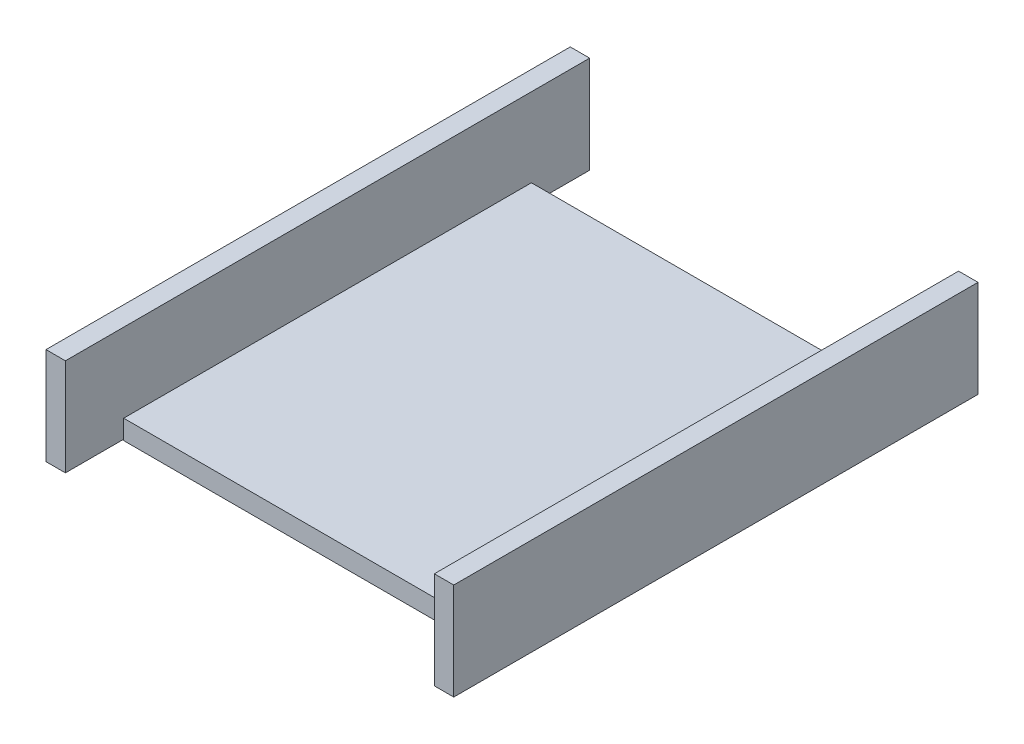
ISO-10303-21;
HEADER;
FILE_DESCRIPTION(('STEP AP214'),'2;1');
FILE_NAME('part.step','',(''),(''),'','','');
FILE_SCHEMA(('AUTOMOTIVE_DESIGN { 1 0 10303 214 1 1 1 1 }'));
ENDSEC;
DATA;
#1=APPLICATION_CONTEXT('core data for automotive mechanical design processes');
#2=APPLICATION_PROTOCOL_DEFINITION('international standard','automotive_design',2000,#1);
#3=PRODUCT_CONTEXT('',#1,'mechanical');
#4=PRODUCT('Part','Part','',(#3));
#5=PRODUCT_RELATED_PRODUCT_CATEGORY('part','',(#4));
#6=PRODUCT_DEFINITION_FORMATION('','',#4);
#7=PRODUCT_DEFINITION_CONTEXT('part definition',#1,'design');
#8=PRODUCT_DEFINITION('design','',#6,#7);
#9=PRODUCT_DEFINITION_SHAPE('','',#8);
#10=(LENGTH_UNIT() NAMED_UNIT(*) SI_UNIT(.MILLI.,.METRE.));
#11=(NAMED_UNIT(*) PLANE_ANGLE_UNIT() SI_UNIT($,.RADIAN.));
#12=(NAMED_UNIT(*) SI_UNIT($,.STERADIAN.) SOLID_ANGLE_UNIT());
#13=UNCERTAINTY_MEASURE_WITH_UNIT(LENGTH_MEASURE(1.E-05),#10,'distance_accuracy_value','');
#14=(GEOMETRIC_REPRESENTATION_CONTEXT(3) GLOBAL_UNCERTAINTY_ASSIGNED_CONTEXT((#13)) GLOBAL_UNIT_ASSIGNED_CONTEXT((#10,
#11,#12)) REPRESENTATION_CONTEXT('',''));
#15=CARTESIAN_POINT('',(0.,0.,0.));
#16=DIRECTION('',(0.,0.,1.));
#17=DIRECTION('',(1.,0.,0.));
#18=AXIS2_PLACEMENT_3D('',#15,#16,#17);
#19=CARTESIAN_POINT('',(5.,12.5,-67.5));
#20=DIRECTION('',(0.,0.,1.));
#21=DIRECTION('',(1.,0.,0.));
#22=AXIS2_PLACEMENT_3D('',#19,#20,#21);
#23=PLANE('',#22);
#24=DIRECTION('',(0.,1.,0.));
#25=VECTOR('',#24,1.);
#26=CARTESIAN_POINT('',(0.,12.5,-67.5));
#27=LINE('',#26,#25);
#28=CARTESIAN_POINT('',(0.,-12.5,-67.5));
#29=VERTEX_POINT('',#28);
#30=CARTESIAN_POINT('',(0.,12.5,-67.5));
#31=VERTEX_POINT('',#30);
#32=EDGE_CURVE('E202',#29,#31,#27,.T.);
#33=ORIENTED_EDGE('',*,*,#32,.T.);
#34=DIRECTION('',(-1.,0.,0.));
#35=VECTOR('',#34,1.);
#36=CARTESIAN_POINT('',(5.,12.5,-67.5));
#37=LINE('',#36,#35);
#38=CARTESIAN_POINT('',(5.,12.5,-67.5));
#39=VERTEX_POINT('',#38);
#40=EDGE_CURVE('E38',#39,#31,#37,.T.);
#41=ORIENTED_EDGE('',*,*,#40,.F.);
#42=DIRECTION('',(0.,1.,0.));
#43=VECTOR('',#42,1.);
#44=CARTESIAN_POINT('',(5.,12.5,-67.5));
#45=LINE('',#44,#43);
#46=CARTESIAN_POINT('',(5.,-12.5,-67.5));
#47=VERTEX_POINT('',#46);
#48=EDGE_CURVE('E203',#47,#39,#45,.T.);
#49=ORIENTED_EDGE('',*,*,#48,.F.);
#50=DIRECTION('',(-1.,0.,0.));
#51=VECTOR('',#50,1.);
#52=CARTESIAN_POINT('',(5.,-12.5,-67.5));
#53=LINE('',#52,#51);
#54=EDGE_CURVE('E214',#47,#29,#53,.T.);
#55=ORIENTED_EDGE('',*,*,#54,.T.);
#56=EDGE_LOOP('',(#33,#41,#49,#55));
#57=FACE_BOUND('',#56,.T.);
#58=ADVANCED_FACE('F35',(#57),#23,.F.);
#59=CARTESIAN_POINT('',(5.,12.5,67.5));
#60=DIRECTION('',(0.,-1.,0.));
#61=DIRECTION('',(0.,0.,-1.));
#62=AXIS2_PLACEMENT_3D('',#59,#60,#61);
#63=PLANE('',#62);
#64=DIRECTION('',(0.,0.,1.));
#65=VECTOR('',#64,1.);
#66=CARTESIAN_POINT('',(0.,12.5,67.5));
#67=LINE('',#66,#65);
#68=CARTESIAN_POINT('',(0.,12.5,67.5));
#69=VERTEX_POINT('',#68);
#70=EDGE_CURVE('E218',#31,#69,#67,.T.);
#71=ORIENTED_EDGE('',*,*,#70,.T.);
#72=DIRECTION('',(-1.,0.,0.));
#73=VECTOR('',#72,1.);
#74=CARTESIAN_POINT('',(5.,12.5,67.5));
#75=LINE('',#74,#73);
#76=CARTESIAN_POINT('',(5.,12.5,67.5));
#77=VERTEX_POINT('',#76);
#78=EDGE_CURVE('E227',#77,#69,#75,.T.);
#79=ORIENTED_EDGE('',*,*,#78,.F.);
#80=DIRECTION('',(0.,0.,1.));
#81=VECTOR('',#80,1.);
#82=CARTESIAN_POINT('',(5.,12.5,67.5));
#83=LINE('',#82,#81);
#84=EDGE_CURVE('E206',#39,#77,#83,.T.);
#85=ORIENTED_EDGE('',*,*,#84,.F.);
#86=ORIENTED_EDGE('',*,*,#40,.T.);
#87=EDGE_LOOP('',(#71,#79,#85,#86));
#88=FACE_BOUND('',#87,.T.);
#89=ADVANCED_FACE('F274',(#88),#63,.F.);
#90=CARTESIAN_POINT('',(5.,12.5,67.5));
#91=DIRECTION('',(0.,0.,-1.));
#92=DIRECTION('',(-1.,0.,0.));
#93=AXIS2_PLACEMENT_3D('',#90,#91,#92);
#94=PLANE('',#93);
#95=DIRECTION('',(0.,-1.,0.));
#96=VECTOR('',#95,1.);
#97=CARTESIAN_POINT('',(0.,12.5,67.5));
#98=LINE('',#97,#96);
#99=CARTESIAN_POINT('',(0.,-12.5,67.5));
#100=VERTEX_POINT('',#99);
#101=EDGE_CURVE('E220',#69,#100,#98,.T.);
#102=ORIENTED_EDGE('',*,*,#101,.T.);
#103=DIRECTION('',(-1.,0.,0.));
#104=VECTOR('',#103,1.);
#105=CARTESIAN_POINT('',(5.,-12.5,67.5));
#106=LINE('',#105,#104);
#107=CARTESIAN_POINT('',(5.,-12.5,67.5));
#108=VERTEX_POINT('',#107);
#109=EDGE_CURVE('E225',#108,#100,#106,.T.);
#110=ORIENTED_EDGE('',*,*,#109,.F.);
#111=DIRECTION('',(0.,-1.,0.));
#112=VECTOR('',#111,1.);
#113=CARTESIAN_POINT('',(5.,12.5,67.5));
#114=LINE('',#113,#112);
#115=EDGE_CURVE('E209',#77,#108,#114,.T.);
#116=ORIENTED_EDGE('',*,*,#115,.F.);
#117=ORIENTED_EDGE('',*,*,#78,.T.);
#118=EDGE_LOOP('',(#102,#110,#116,#117));
#119=FACE_BOUND('',#118,.T.);
#120=ADVANCED_FACE('F276',(#119),#94,.F.);
#121=CARTESIAN_POINT('',(5.,-12.5,67.5));
#122=DIRECTION('',(0.,1.,0.));
#123=DIRECTION('',(0.,0.,1.));
#124=AXIS2_PLACEMENT_3D('',#121,#122,#123);
#125=PLANE('',#124);
#126=DIRECTION('',(0.,0.,-1.));
#127=VECTOR('',#126,1.);
#128=CARTESIAN_POINT('',(0.,-12.5,67.5));
#129=LINE('',#128,#127);
#130=EDGE_CURVE('E207',#100,#29,#129,.T.);
#131=ORIENTED_EDGE('',*,*,#130,.T.);
#132=ORIENTED_EDGE('',*,*,#54,.F.);
#133=DIRECTION('',(0.,0.,-1.));
#134=VECTOR('',#133,1.);
#135=CARTESIAN_POINT('',(5.,-12.5,67.5));
#136=LINE('',#135,#134);
#137=CARTESIAN_POINT('',(5.,-12.5,-52.5));
#138=VERTEX_POINT('',#137);
#139=EDGE_CURVE('E211',#138,#47,#136,.T.);
#140=ORIENTED_EDGE('',*,*,#139,.F.);
#141=CARTESIAN_POINT('',(5.,-12.5,52.5));
#142=VERTEX_POINT('',#141);
#143=EDGE_CURVE('E215',#142,#138,#136,.T.);
#144=ORIENTED_EDGE('',*,*,#143,.F.);
#145=EDGE_CURVE('E212',#108,#142,#136,.T.);
#146=ORIENTED_EDGE('',*,*,#145,.F.);
#147=ORIENTED_EDGE('',*,*,#109,.T.);
#148=EDGE_LOOP('',(#131,#132,#140,#144,#146,#147));
#149=FACE_BOUND('',#148,.T.);
#150=ADVANCED_FACE('F268',(#149),#125,.F.);
#151=CARTESIAN_POINT('',(5.,0.,0.));
#152=DIRECTION('',(1.,0.,0.));
#153=DIRECTION('',(0.,0.,-1.));
#154=AXIS2_PLACEMENT_3D('',#151,#152,#153);
#155=PLANE('',#154);
#156=DIRECTION('',(0.,-1.,0.));
#157=VECTOR('',#156,1.);
#158=CARTESIAN_POINT('',(5.,-12.8008709671914,52.5));
#159=LINE('',#158,#157);
#160=CARTESIAN_POINT('',(5.,-7.80087096719144,52.5));
#161=VERTEX_POINT('',#160);
#162=EDGE_CURVE('E59',#161,#142,#159,.T.);
#163=ORIENTED_EDGE('',*,*,#162,.F.);
#164=DIRECTION('',(0.,0.,1.));
#165=VECTOR('',#164,1.);
#166=CARTESIAN_POINT('',(5.,-7.80087096719143,-52.5));
#167=LINE('',#166,#165);
#168=CARTESIAN_POINT('',(5.,-7.80087096719143,-52.5));
#169=VERTEX_POINT('',#168);
#170=EDGE_CURVE('E189',#169,#161,#167,.T.);
#171=ORIENTED_EDGE('',*,*,#170,.F.);
#172=DIRECTION('',(0.,1.,0.));
#173=VECTOR('',#172,1.);
#174=CARTESIAN_POINT('',(5.,-12.8008709671914,-52.5));
#175=LINE('',#174,#173);
#176=EDGE_CURVE('E43',#138,#169,#175,.T.);
#177=ORIENTED_EDGE('',*,*,#176,.F.);
#178=ORIENTED_EDGE('',*,*,#139,.T.);
#179=ORIENTED_EDGE('',*,*,#48,.T.);
#180=ORIENTED_EDGE('',*,*,#84,.T.);
#181=ORIENTED_EDGE('',*,*,#115,.T.);
#182=ORIENTED_EDGE('',*,*,#145,.T.);
#183=EDGE_LOOP('',(#163,#171,#177,#178,#179,#180,#181,#182));
#184=FACE_BOUND('',#183,.T.);
#185=ADVANCED_FACE('F266',(#184),#155,.T.);
#186=CARTESIAN_POINT('',(0.,0.,0.));
#187=DIRECTION('',(1.,0.,0.));
#188=DIRECTION('',(0.,0.,-1.));
#189=AXIS2_PLACEMENT_3D('',#186,#187,#188);
#190=PLANE('',#189);
#191=ORIENTED_EDGE('',*,*,#32,.F.);
#192=ORIENTED_EDGE('',*,*,#130,.F.);
#193=ORIENTED_EDGE('',*,*,#101,.F.);
#194=ORIENTED_EDGE('',*,*,#70,.F.);
#195=EDGE_LOOP('',(#191,#192,#193,#194));
#196=FACE_BOUND('',#195,.T.);
#197=ADVANCED_FACE('F273',(#196),#190,.F.);
#198=CARTESIAN_POINT('',(5.,0.,0.));
#199=DIRECTION('',(1.,0.,0.));
#200=DIRECTION('',(0.,0.,-1.));
#201=AXIS2_PLACEMENT_3D('',#198,#199,#200);
#202=PLANE('',#201);
#203=CARTESIAN_POINT('',(5.,-12.8008709671914,52.5));
#204=VERTEX_POINT('',#203);
#205=EDGE_CURVE('E164',#142,#204,#159,.T.);
#206=ORIENTED_EDGE('',*,*,#205,.F.);
#207=ORIENTED_EDGE('',*,*,#143,.T.);
#208=CARTESIAN_POINT('',(5.,-12.8008709671914,-52.5));
#209=VERTEX_POINT('',#208);
#210=EDGE_CURVE('E186',#209,#138,#175,.T.);
#211=ORIENTED_EDGE('',*,*,#210,.F.);
#212=DIRECTION('',(0.,0.,-1.));
#213=VECTOR('',#212,1.);
#214=CARTESIAN_POINT('',(5.,-12.8008709671914,-52.5));
#215=LINE('',#214,#213);
#216=EDGE_CURVE('E184',#204,#209,#215,.T.);
#217=ORIENTED_EDGE('',*,*,#216,.F.);
#218=EDGE_LOOP('',(#206,#207,#211,#217));
#219=FACE_BOUND('',#218,.T.);
#220=ADVANCED_FACE('F261',(#219),#202,.F.);
#221=CARTESIAN_POINT('',(100.,-12.8008709671914,52.5));
#222=DIRECTION('',(0.,0.,-1.));
#223=DIRECTION('',(-1.,0.,0.));
#224=AXIS2_PLACEMENT_3D('',#221,#222,#223);
#225=PLANE('',#224);
#226=ORIENTED_EDGE('',*,*,#162,.T.);
#227=ORIENTED_EDGE('',*,*,#205,.T.);
#228=DIRECTION('',(-1.,0.,0.));
#229=VECTOR('',#228,1.);
#230=CARTESIAN_POINT('',(100.,-12.8008709671914,52.5));
#231=LINE('',#230,#229);
#232=CARTESIAN_POINT('',(100.,-12.8008709671914,52.5));
#233=VERTEX_POINT('',#232);
#234=EDGE_CURVE('E199',#233,#204,#231,.T.);
#235=ORIENTED_EDGE('',*,*,#234,.F.);
#236=DIRECTION('',(0.,-1.,0.));
#237=VECTOR('',#236,1.);
#238=CARTESIAN_POINT('',(100.,-12.8008709671914,52.5));
#239=LINE('',#238,#237);
#240=CARTESIAN_POINT('',(100.,-12.5,52.5));
#241=VERTEX_POINT('',#240);
#242=EDGE_CURVE('E175',#241,#233,#239,.T.);
#243=ORIENTED_EDGE('',*,*,#242,.F.);
#244=CARTESIAN_POINT('',(100.,-7.80087096719144,52.5));
#245=VERTEX_POINT('',#244);
#246=EDGE_CURVE('E171',#245,#241,#239,.T.);
#247=ORIENTED_EDGE('',*,*,#246,.F.);
#248=DIRECTION('',(-1.,0.,0.));
#249=VECTOR('',#248,1.);
#250=CARTESIAN_POINT('',(100.,-7.80087096719144,52.5));
#251=LINE('',#250,#249);
#252=EDGE_CURVE('E182',#245,#161,#251,.T.);
#253=ORIENTED_EDGE('',*,*,#252,.T.);
#254=EDGE_LOOP('',(#226,#227,#235,#243,#247,#253));
#255=FACE_BOUND('',#254,.T.);
#256=ADVANCED_FACE('F322',(#255),#225,.F.);
#257=CARTESIAN_POINT('',(100.,-12.8008709671914,-52.5));
#258=DIRECTION('',(0.,1.,0.));
#259=DIRECTION('',(0.,0.,1.));
#260=AXIS2_PLACEMENT_3D('',#257,#258,#259);
#261=PLANE('',#260);
#262=ORIENTED_EDGE('',*,*,#216,.T.);
#263=DIRECTION('',(-1.,0.,0.));
#264=VECTOR('',#263,1.);
#265=CARTESIAN_POINT('',(100.,-12.8008709671914,-52.5));
#266=LINE('',#265,#264);
#267=CARTESIAN_POINT('',(100.,-12.8008709671914,-52.5));
#268=VERTEX_POINT('',#267);
#269=EDGE_CURVE('E196',#268,#209,#266,.T.);
#270=ORIENTED_EDGE('',*,*,#269,.F.);
#271=DIRECTION('',(0.,0.,-1.));
#272=VECTOR('',#271,1.);
#273=CARTESIAN_POINT('',(100.,-12.8008709671914,-52.5));
#274=LINE('',#273,#272);
#275=EDGE_CURVE('E174',#233,#268,#274,.T.);
#276=ORIENTED_EDGE('',*,*,#275,.F.);
#277=ORIENTED_EDGE('',*,*,#234,.T.);
#278=EDGE_LOOP('',(#262,#270,#276,#277));
#279=FACE_BOUND('',#278,.T.);
#280=ADVANCED_FACE('F257',(#279),#261,.F.);
#281=CARTESIAN_POINT('',(100.,-12.8008709671914,-52.5));
#282=DIRECTION('',(0.,0.,1.));
#283=DIRECTION('',(1.,0.,0.));
#284=AXIS2_PLACEMENT_3D('',#281,#282,#283);
#285=PLANE('',#284);
#286=ORIENTED_EDGE('',*,*,#210,.T.);
#287=ORIENTED_EDGE('',*,*,#176,.T.);
#288=DIRECTION('',(-1.,0.,0.));
#289=VECTOR('',#288,1.);
#290=CARTESIAN_POINT('',(100.,-7.80087096719143,-52.5));
#291=LINE('',#290,#289);
#292=CARTESIAN_POINT('',(100.,-7.80087096719143,-52.5));
#293=VERTEX_POINT('',#292);
#294=EDGE_CURVE('E193',#293,#169,#291,.T.);
#295=ORIENTED_EDGE('',*,*,#294,.F.);
#296=DIRECTION('',(0.,1.,0.));
#297=VECTOR('',#296,1.);
#298=CARTESIAN_POINT('',(100.,-12.8008709671914,-52.5));
#299=LINE('',#298,#297);
#300=CARTESIAN_POINT('',(100.,-12.5,-52.5));
#301=VERTEX_POINT('',#300);
#302=EDGE_CURVE('E177',#301,#293,#299,.T.);
#303=ORIENTED_EDGE('',*,*,#302,.F.);
#304=EDGE_CURVE('E178',#268,#301,#299,.T.);
#305=ORIENTED_EDGE('',*,*,#304,.F.);
#306=ORIENTED_EDGE('',*,*,#269,.T.);
#307=EDGE_LOOP('',(#286,#287,#295,#303,#305,#306));
#308=FACE_BOUND('',#307,.T.);
#309=ADVANCED_FACE('F238',(#308),#285,.F.);
#310=CARTESIAN_POINT('',(100.,-7.80087096719143,-52.5));
#311=DIRECTION('',(0.,-1.,0.));
#312=DIRECTION('',(0.,0.,-1.));
#313=AXIS2_PLACEMENT_3D('',#310,#311,#312);
#314=PLANE('',#313);
#315=ORIENTED_EDGE('',*,*,#170,.T.);
#316=ORIENTED_EDGE('',*,*,#252,.F.);
#317=DIRECTION('',(0.,0.,1.));
#318=VECTOR('',#317,1.);
#319=CARTESIAN_POINT('',(100.,-7.80087096719143,-52.5));
#320=LINE('',#319,#318);
#321=EDGE_CURVE('E180',#293,#245,#320,.T.);
#322=ORIENTED_EDGE('',*,*,#321,.F.);
#323=ORIENTED_EDGE('',*,*,#294,.T.);
#324=EDGE_LOOP('',(#315,#316,#322,#323));
#325=FACE_BOUND('',#324,.T.);
#326=ADVANCED_FACE('F244',(#325),#314,.F.);
#327=CARTESIAN_POINT('',(100.,0.,0.));
#328=DIRECTION('',(1.,0.,0.));
#329=DIRECTION('',(0.,0.,-1.));
#330=AXIS2_PLACEMENT_3D('',#327,#328,#329);
#331=PLANE('',#330);
#332=DIRECTION('',(0.,0.,-1.));
#333=VECTOR('',#332,1.);
#334=CARTESIAN_POINT('',(100.,-12.5,-67.5));
#335=LINE('',#334,#333);
#336=EDGE_CURVE('E11',#241,#301,#335,.T.);
#337=ORIENTED_EDGE('',*,*,#336,.F.);
#338=ORIENTED_EDGE('',*,*,#242,.T.);
#339=ORIENTED_EDGE('',*,*,#275,.T.);
#340=ORIENTED_EDGE('',*,*,#304,.T.);
#341=EDGE_LOOP('',(#337,#338,#339,#340));
#342=FACE_BOUND('',#341,.T.);
#343=ADVANCED_FACE('F253',(#342),#331,.T.);
#344=CARTESIAN_POINT('',(105.,12.5,67.5));
#345=DIRECTION('',(0.,0.,-1.));
#346=DIRECTION('',(-1.,0.,0.));
#347=AXIS2_PLACEMENT_3D('',#344,#345,#346);
#348=PLANE('',#347);
#349=DIRECTION('',(0.,-1.,0.));
#350=VECTOR('',#349,1.);
#351=CARTESIAN_POINT('',(100.,12.5,67.5));
#352=LINE('',#351,#350);
#353=CARTESIAN_POINT('',(100.,12.5,67.5));
#354=VERTEX_POINT('',#353);
#355=CARTESIAN_POINT('',(100.,-12.5,67.5));
#356=VERTEX_POINT('',#355);
#357=EDGE_CURVE('E163',#354,#356,#352,.T.);
#358=ORIENTED_EDGE('',*,*,#357,.T.);
#359=DIRECTION('',(-1.,0.,0.));
#360=VECTOR('',#359,1.);
#361=CARTESIAN_POINT('',(105.,-12.5,67.5));
#362=LINE('',#361,#360);
#363=CARTESIAN_POINT('',(105.,-12.5,67.5));
#364=VERTEX_POINT('',#363);
#365=EDGE_CURVE('E143',#364,#356,#362,.T.);
#366=ORIENTED_EDGE('',*,*,#365,.F.);
#367=DIRECTION('',(0.,-1.,0.));
#368=VECTOR('',#367,1.);
#369=CARTESIAN_POINT('',(105.,12.5,67.5));
#370=LINE('',#369,#368);
#371=CARTESIAN_POINT('',(105.,12.5,67.5));
#372=VERTEX_POINT('',#371);
#373=EDGE_CURVE('E150',#372,#364,#370,.T.);
#374=ORIENTED_EDGE('',*,*,#373,.F.);
#375=DIRECTION('',(-1.,0.,0.));
#376=VECTOR('',#375,1.);
#377=CARTESIAN_POINT('',(105.,12.5,67.5));
#378=LINE('',#377,#376);
#379=EDGE_CURVE('E421',#372,#354,#378,.T.);
#380=ORIENTED_EDGE('',*,*,#379,.T.);
#381=EDGE_LOOP('',(#358,#366,#374,#380));
#382=FACE_BOUND('',#381,.T.);
#383=ADVANCED_FACE('F161',(#382),#348,.F.);
#384=CARTESIAN_POINT('',(105.,-12.5,-67.5));
#385=DIRECTION('',(0.,1.,0.));
#386=DIRECTION('',(0.,0.,1.));
#387=AXIS2_PLACEMENT_3D('',#384,#385,#386);
#388=PLANE('',#387);
#389=EDGE_CURVE('E45',#356,#241,#335,.T.);
#390=ORIENTED_EDGE('',*,*,#389,.T.);
#391=ORIENTED_EDGE('',*,*,#336,.T.);
#392=CARTESIAN_POINT('',(100.,-12.5,-67.5));
#393=VERTEX_POINT('',#392);
#394=EDGE_CURVE('E46',#301,#393,#335,.T.);
#395=ORIENTED_EDGE('',*,*,#394,.T.);
#396=DIRECTION('',(-1.,0.,0.));
#397=VECTOR('',#396,1.);
#398=CARTESIAN_POINT('',(105.,-12.5,-67.5));
#399=LINE('',#398,#397);
#400=CARTESIAN_POINT('',(105.,-12.5,-67.5));
#401=VERTEX_POINT('',#400);
#402=EDGE_CURVE('E146',#401,#393,#399,.T.);
#403=ORIENTED_EDGE('',*,*,#402,.F.);
#404=DIRECTION('',(0.,0.,-1.));
#405=VECTOR('',#404,1.);
#406=CARTESIAN_POINT('',(105.,-12.5,-67.5));
#407=LINE('',#406,#405);
#408=EDGE_CURVE('E138',#364,#401,#407,.T.);
#409=ORIENTED_EDGE('',*,*,#408,.F.);
#410=ORIENTED_EDGE('',*,*,#365,.T.);
#411=EDGE_LOOP('',(#390,#391,#395,#403,#409,#410));
#412=FACE_BOUND('',#411,.T.);
#413=ADVANCED_FACE('F141',(#412),#388,.F.);
#414=CARTESIAN_POINT('',(105.,12.5,-67.5));
#415=DIRECTION('',(0.,0.,1.));
#416=DIRECTION('',(1.,0.,0.));
#417=AXIS2_PLACEMENT_3D('',#414,#415,#416);
#418=PLANE('',#417);
#419=DIRECTION('',(0.,1.,0.));
#420=VECTOR('',#419,1.);
#421=CARTESIAN_POINT('',(100.,12.5,-67.5));
#422=LINE('',#421,#420);
#423=CARTESIAN_POINT('',(100.,12.5,-67.5));
#424=VERTEX_POINT('',#423);
#425=EDGE_CURVE('E423',#393,#424,#422,.T.);
#426=ORIENTED_EDGE('',*,*,#425,.T.);
#427=DIRECTION('',(-1.,0.,0.));
#428=VECTOR('',#427,1.);
#429=CARTESIAN_POINT('',(105.,12.5,-67.5));
#430=LINE('',#429,#428);
#431=CARTESIAN_POINT('',(105.,12.5,-67.5));
#432=VERTEX_POINT('',#431);
#433=EDGE_CURVE('E167',#432,#424,#430,.T.);
#434=ORIENTED_EDGE('',*,*,#433,.F.);
#435=DIRECTION('',(0.,1.,0.));
#436=VECTOR('',#435,1.);
#437=CARTESIAN_POINT('',(105.,12.5,-67.5));
#438=LINE('',#437,#436);
#439=EDGE_CURVE('E149',#401,#432,#438,.T.);
#440=ORIENTED_EDGE('',*,*,#439,.F.);
#441=ORIENTED_EDGE('',*,*,#402,.T.);
#442=EDGE_LOOP('',(#426,#434,#440,#441));
#443=FACE_BOUND('',#442,.T.);
#444=ADVANCED_FACE('F380',(#443),#418,.F.);
#445=CARTESIAN_POINT('',(105.,12.5,-67.5));
#446=DIRECTION('',(0.,-1.,0.));
#447=DIRECTION('',(0.,0.,-1.));
#448=AXIS2_PLACEMENT_3D('',#445,#446,#447);
#449=PLANE('',#448);
#450=DIRECTION('',(0.,0.,1.));
#451=VECTOR('',#450,1.);
#452=CARTESIAN_POINT('',(100.,12.5,-67.5));
#453=LINE('',#452,#451);
#454=EDGE_CURVE('E159',#424,#354,#453,.T.);
#455=ORIENTED_EDGE('',*,*,#454,.T.);
#456=ORIENTED_EDGE('',*,*,#379,.F.);
#457=DIRECTION('',(0.,0.,1.));
#458=VECTOR('',#457,1.);
#459=CARTESIAN_POINT('',(105.,12.5,-67.5));
#460=LINE('',#459,#458);
#461=EDGE_CURVE('E155',#432,#372,#460,.T.);
#462=ORIENTED_EDGE('',*,*,#461,.F.);
#463=ORIENTED_EDGE('',*,*,#433,.T.);
#464=EDGE_LOOP('',(#455,#456,#462,#463));
#465=FACE_BOUND('',#464,.T.);
#466=ADVANCED_FACE('F389',(#465),#449,.F.);
#467=CARTESIAN_POINT('',(105.,0.,0.));
#468=DIRECTION('',(-1.,0.,0.));
#469=DIRECTION('',(0.,0.,1.));
#470=AXIS2_PLACEMENT_3D('',#467,#468,#469);
#471=PLANE('',#470);
#472=ORIENTED_EDGE('',*,*,#373,.T.);
#473=ORIENTED_EDGE('',*,*,#408,.T.);
#474=ORIENTED_EDGE('',*,*,#439,.T.);
#475=ORIENTED_EDGE('',*,*,#461,.T.);
#476=EDGE_LOOP('',(#472,#473,#474,#475));
#477=FACE_BOUND('',#476,.T.);
#478=ADVANCED_FACE('F153',(#477),#471,.F.);
#479=CARTESIAN_POINT('',(100.,0.,0.));
#480=DIRECTION('',(-1.,0.,0.));
#481=DIRECTION('',(0.,0.,1.));
#482=AXIS2_PLACEMENT_3D('',#479,#480,#481);
#483=PLANE('',#482);
#484=ORIENTED_EDGE('',*,*,#321,.T.);
#485=ORIENTED_EDGE('',*,*,#246,.T.);
#486=ORIENTED_EDGE('',*,*,#389,.F.);
#487=ORIENTED_EDGE('',*,*,#357,.F.);
#488=ORIENTED_EDGE('',*,*,#454,.F.);
#489=ORIENTED_EDGE('',*,*,#425,.F.);
#490=ORIENTED_EDGE('',*,*,#394,.F.);
#491=ORIENTED_EDGE('',*,*,#302,.T.);
#492=EDGE_LOOP('',(#484,#485,#486,#487,#488,#489,#490,#491));
#493=FACE_BOUND('',#492,.T.);
#494=ADVANCED_FACE('F249',(#493),#483,.T.);
#495=CLOSED_SHELL('',(#58,#89,#120,#150,#185,#197,#220,#256,#280,#309,#326,#343,#383,#413,#444,
#466,#478,#494));
#496=MANIFOLD_SOLID_BREP('B2',#495);
#497=ADVANCED_BREP_SHAPE_REPRESENTATION('',(#18,#496),#14);
#498=SHAPE_DEFINITION_REPRESENTATION(#9,#497);
ENDSEC;
END-ISO-10303-21;
